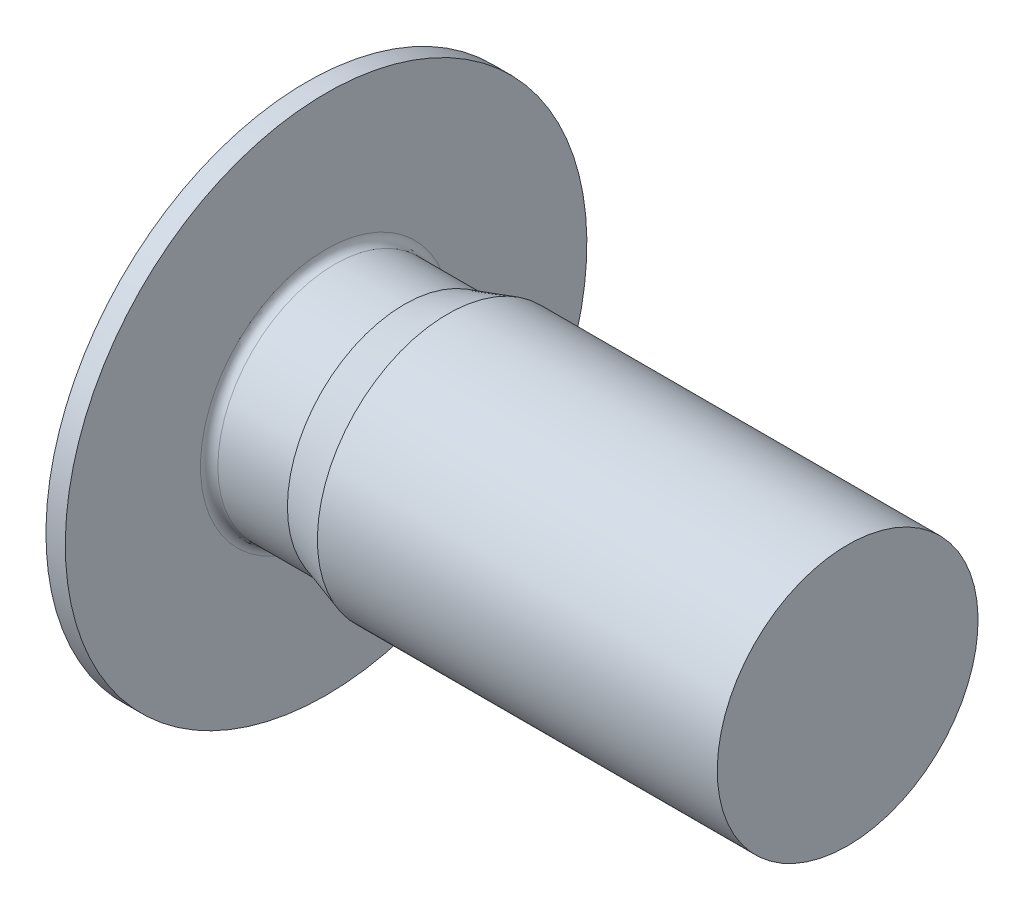
ISO-10303-21;
HEADER;
FILE_DESCRIPTION(('STEP AP214'),'2;1');
FILE_NAME('part.step','',(''),(''),'','','');
FILE_SCHEMA(('AUTOMOTIVE_DESIGN { 1 0 10303 214 1 1 1 1 }'));
ENDSEC;
DATA;
#1=APPLICATION_CONTEXT('core data for automotive mechanical design processes');
#2=APPLICATION_PROTOCOL_DEFINITION('international standard','automotive_design',2000,#1);
#3=PRODUCT_CONTEXT('',#1,'mechanical');
#4=PRODUCT('Part','Part','',(#3));
#5=PRODUCT_RELATED_PRODUCT_CATEGORY('part','',(#4));
#6=PRODUCT_DEFINITION_FORMATION('','',#4);
#7=PRODUCT_DEFINITION_CONTEXT('part definition',#1,'design');
#8=PRODUCT_DEFINITION('design','',#6,#7);
#9=PRODUCT_DEFINITION_SHAPE('','',#8);
#10=(LENGTH_UNIT() NAMED_UNIT(*) SI_UNIT(.MILLI.,.METRE.));
#11=(NAMED_UNIT(*) PLANE_ANGLE_UNIT() SI_UNIT($,.RADIAN.));
#12=(NAMED_UNIT(*) SI_UNIT($,.STERADIAN.) SOLID_ANGLE_UNIT());
#13=UNCERTAINTY_MEASURE_WITH_UNIT(LENGTH_MEASURE(1.E-05),#10,'distance_accuracy_value','');
#14=(GEOMETRIC_REPRESENTATION_CONTEXT(3) GLOBAL_UNCERTAINTY_ASSIGNED_CONTEXT((#13)) GLOBAL_UNIT_ASSIGNED_CONTEXT((#10,
#11,#12)) REPRESENTATION_CONTEXT('',''));
#15=CARTESIAN_POINT('',(0.,0.,0.));
#16=DIRECTION('',(0.,0.,1.));
#17=DIRECTION('',(1.,0.,0.));
#18=AXIS2_PLACEMENT_3D('',#15,#16,#17);
#19=CARTESIAN_POINT('',(1.2,0.,0.));
#20=DIRECTION('',(-1.,0.,0.));
#21=DIRECTION('',(0.,0.,1.));
#22=AXIS2_PLACEMENT_3D('',#19,#20,#21);
#23=PLANE('',#22);
#24=CARTESIAN_POINT('',(1.2,0.,0.));
#25=DIRECTION('',(-1.,0.,0.));
#26=DIRECTION('',(0.,-1.,0.));
#27=AXIS2_PLACEMENT_3D('',#24,#25,#26);
#28=CIRCLE('',#27,0.75);
#29=CARTESIAN_POINT('',(1.2,-0.649519052838329,0.375));
#30=VERTEX_POINT('',#29);
#31=CARTESIAN_POINT('',(1.2,0.,0.75));
#32=VERTEX_POINT('',#31);
#33=EDGE_CURVE('E58',#30,#32,#28,.T.);
#34=ORIENTED_EDGE('',*,*,#33,.F.);
#35=DIRECTION('',(0.,0.5,0.866025403784439));
#36=VECTOR('',#35,1.);
#37=CARTESIAN_POINT('',(1.2,-0.866025403784439,0.));
#38=LINE('',#37,#36);
#39=CARTESIAN_POINT('',(1.2,-0.43301270189222,0.75));
#40=VERTEX_POINT('',#39);
#41=EDGE_CURVE('E309',#30,#40,#38,.T.);
#42=ORIENTED_EDGE('',*,*,#41,.T.);
#43=DIRECTION('',(0.,1.,0.));
#44=VECTOR('',#43,1.);
#45=CARTESIAN_POINT('',(1.2,-0.43301270189222,0.75));
#46=LINE('',#45,#44);
#47=EDGE_CURVE('E261',#40,#32,#46,.T.);
#48=ORIENTED_EDGE('',*,*,#47,.T.);
#49=EDGE_LOOP('',(#34,#42,#48));
#50=FACE_BOUND('',#49,.T.);
#51=ADVANCED_FACE('F46',(#50),#23,.T.);
#52=CARTESIAN_POINT('',(1.2,0.649519052838329,0.375));
#53=VERTEX_POINT('',#52);
#54=EDGE_CURVE('E11',#32,#53,#28,.T.);
#55=ORIENTED_EDGE('',*,*,#54,.F.);
#56=CARTESIAN_POINT('',(1.2,0.43301270189222,0.75));
#57=VERTEX_POINT('',#56);
#58=EDGE_CURVE('E298',#32,#57,#46,.T.);
#59=ORIENTED_EDGE('',*,*,#58,.T.);
#60=DIRECTION('',(0.,0.5,-0.866025403784439));
#61=VECTOR('',#60,1.);
#62=CARTESIAN_POINT('',(1.2,0.43301270189222,0.75));
#63=LINE('',#62,#61);
#64=EDGE_CURVE('E328',#57,#53,#63,.T.);
#65=ORIENTED_EDGE('',*,*,#64,.T.);
#66=EDGE_LOOP('',(#55,#59,#65));
#67=FACE_BOUND('',#66,.T.);
#68=ADVANCED_FACE('F134',(#67),#23,.T.);
#69=CARTESIAN_POINT('',(1.2,0.649519052838329,-0.375));
#70=VERTEX_POINT('',#69);
#71=EDGE_CURVE('E56',#53,#70,#28,.T.);
#72=ORIENTED_EDGE('',*,*,#71,.F.);
#73=CARTESIAN_POINT('',(1.2,0.866025403784439,0.));
#74=VERTEX_POINT('',#73);
#75=EDGE_CURVE('E278',#53,#74,#63,.T.);
#76=ORIENTED_EDGE('',*,*,#75,.T.);
#77=DIRECTION('',(0.,-0.5,-0.866025403784439));
#78=VECTOR('',#77,1.);
#79=CARTESIAN_POINT('',(1.2,0.866025403784439,0.));
#80=LINE('',#79,#78);
#81=EDGE_CURVE('E324',#74,#70,#80,.T.);
#82=ORIENTED_EDGE('',*,*,#81,.T.);
#83=EDGE_LOOP('',(#72,#76,#82));
#84=FACE_BOUND('',#83,.T.);
#85=ADVANCED_FACE('F139',(#84),#23,.T.);
#86=CARTESIAN_POINT('',(1.2,0.,-0.75));
#87=VERTEX_POINT('',#86);
#88=EDGE_CURVE('E247',#70,#87,#28,.T.);
#89=ORIENTED_EDGE('',*,*,#88,.F.);
#90=CARTESIAN_POINT('',(1.2,0.433012701892219,-0.75));
#91=VERTEX_POINT('',#90);
#92=EDGE_CURVE('E327',#70,#91,#80,.T.);
#93=ORIENTED_EDGE('',*,*,#92,.T.);
#94=DIRECTION('',(0.,-1.,0.));
#95=VECTOR('',#94,1.);
#96=CARTESIAN_POINT('',(1.2,0.433012701892219,-0.75));
#97=LINE('',#96,#95);
#98=EDGE_CURVE('E319',#91,#87,#97,.T.);
#99=ORIENTED_EDGE('',*,*,#98,.T.);
#100=EDGE_LOOP('',(#89,#93,#99));
#101=FACE_BOUND('',#100,.T.);
#102=ADVANCED_FACE('F198',(#101),#23,.T.);
#103=CARTESIAN_POINT('',(1.2,-0.649519052838329,-0.375));
#104=VERTEX_POINT('',#103);
#105=EDGE_CURVE('E65',#87,#104,#28,.T.);
#106=ORIENTED_EDGE('',*,*,#105,.F.);
#107=CARTESIAN_POINT('',(1.2,-0.43301270189222,-0.75));
#108=VERTEX_POINT('',#107);
#109=EDGE_CURVE('E323',#87,#108,#97,.T.);
#110=ORIENTED_EDGE('',*,*,#109,.T.);
#111=DIRECTION('',(0.,-0.5,0.866025403784438));
#112=VECTOR('',#111,1.);
#113=CARTESIAN_POINT('',(1.2,-0.43301270189222,-0.75));
#114=LINE('',#113,#112);
#115=EDGE_CURVE('E313',#108,#104,#114,.T.);
#116=ORIENTED_EDGE('',*,*,#115,.T.);
#117=EDGE_LOOP('',(#106,#110,#116));
#118=FACE_BOUND('',#117,.T.);
#119=ADVANCED_FACE('F132',(#118),#23,.T.);
#120=CARTESIAN_POINT('',(-0.8,0.,0.));
#121=DIRECTION('',(-1.,0.,0.));
#122=DIRECTION('',(0.,-1.,0.));
#123=AXIS2_PLACEMENT_3D('',#120,#121,#122);
#124=CYLINDRICAL_SURFACE('',#123,1.345);
#125=CARTESIAN_POINT('',(0.1,0.,0.));
#126=DIRECTION('',(-1.,0.,0.));
#127=DIRECTION('',(0.,-1.,0.));
#128=AXIS2_PLACEMENT_3D('',#125,#126,#127);
#129=CIRCLE('',#128,1.345);
#130=CARTESIAN_POINT('',(0.1,-1.345,0.));
#131=VERTEX_POINT('',#130);
#132=EDGE_CURVE('E50',#131,#131,#129,.F.);
#133=ORIENTED_EDGE('',*,*,#132,.T.);
#134=EDGE_LOOP('',(#133));
#135=FACE_BOUND('',#134,.T.);
#136=CARTESIAN_POINT('',(0.9,0.,0.));
#137=DIRECTION('',(-1.,0.,0.));
#138=DIRECTION('',(0.,-1.,0.));
#139=AXIS2_PLACEMENT_3D('',#136,#137,#138);
#140=CIRCLE('',#139,1.345);
#141=CARTESIAN_POINT('',(0.9,-1.345,0.));
#142=VERTEX_POINT('',#141);
#143=EDGE_CURVE('E205',#142,#142,#140,.T.);
#144=ORIENTED_EDGE('',*,*,#143,.T.);
#145=EDGE_LOOP('',(#144));
#146=FACE_BOUND('',#145,.T.);
#147=ADVANCED_FACE('F191',(#135,#146),#124,.T.);
#148=CARTESIAN_POINT('',(0.,3.,0.));
#149=DIRECTION('',(-1.,0.,0.));
#150=DIRECTION('',(0.,-1.,0.));
#151=AXIS2_PLACEMENT_3D('',#148,#149,#150);
#152=PLANE('',#151);
#153=CARTESIAN_POINT('',(0.,0.,0.));
#154=DIRECTION('',(-1.,0.,0.));
#155=DIRECTION('',(0.,-1.,0.));
#156=AXIS2_PLACEMENT_3D('',#153,#154,#155);
#157=CIRCLE('',#156,1.445);
#158=CARTESIAN_POINT('',(0.,-1.445,0.));
#159=VERTEX_POINT('',#158);
#160=EDGE_CURVE('E236',#159,#159,#157,.T.);
#161=ORIENTED_EDGE('',*,*,#160,.T.);
#162=EDGE_LOOP('',(#161));
#163=FACE_BOUND('',#162,.T.);
#164=CARTESIAN_POINT('',(0.,0.,0.));
#165=DIRECTION('',(-1.,0.,0.));
#166=DIRECTION('',(0.,-1.,0.));
#167=AXIS2_PLACEMENT_3D('',#164,#165,#166);
#168=CIRCLE('',#167,3.);
#169=CARTESIAN_POINT('',(0.,-3.,0.));
#170=VERTEX_POINT('',#169);
#171=EDGE_CURVE('E233',#170,#170,#168,.T.);
#172=ORIENTED_EDGE('',*,*,#171,.F.);
#173=EDGE_LOOP('',(#172));
#174=FACE_BOUND('',#173,.T.);
#175=ADVANCED_FACE('F188',(#163,#174),#152,.F.);
#176=CARTESIAN_POINT('',(-0.8,0.,0.));
#177=DIRECTION('',(-1.,0.,0.));
#178=DIRECTION('',(0.,-1.,0.));
#179=AXIS2_PLACEMENT_3D('',#176,#177,#178);
#180=CYLINDRICAL_SURFACE('',#179,3.);
#181=CARTESIAN_POINT('',(-0.222649730810382,0.,0.));
#182=DIRECTION('',(-1.,0.,0.));
#183=DIRECTION('',(0.,-1.,0.));
#184=AXIS2_PLACEMENT_3D('',#181,#182,#183);
#185=CIRCLE('',#184,3.);
#186=CARTESIAN_POINT('',(-0.222649730810382,-3.,0.));
#187=VERTEX_POINT('',#186);
#188=EDGE_CURVE('E229',#187,#187,#185,.T.);
#189=ORIENTED_EDGE('',*,*,#188,.F.);
#190=EDGE_LOOP('',(#189));
#191=FACE_BOUND('',#190,.T.);
#192=ORIENTED_EDGE('',*,*,#171,.T.);
#193=EDGE_LOOP('',(#192));
#194=FACE_BOUND('',#193,.T.);
#195=ADVANCED_FACE('F184',(#191,#194),#180,.T.);
#196=CARTESIAN_POINT('',(-0.222649730810382,0.,0.));
#197=DIRECTION('',(1.,0.,0.));
#198=DIRECTION('',(0.,1.,0.));
#199=AXIS2_PLACEMENT_3D('',#196,#197,#198);
#200=CONICAL_SURFACE('',#199,3.,1.0471975511966);
#201=CARTESIAN_POINT('',(-0.8,0.,0.));
#202=DIRECTION('',(-1.,0.,0.));
#203=DIRECTION('',(0.,-1.,0.));
#204=AXIS2_PLACEMENT_3D('',#201,#202,#203);
#205=CIRCLE('',#204,2.);
#206=CARTESIAN_POINT('',(-0.799999999999999,-2.,0.));
#207=VERTEX_POINT('',#206);
#208=EDGE_CURVE('E225',#207,#207,#205,.T.);
#209=ORIENTED_EDGE('',*,*,#208,.F.);
#210=EDGE_LOOP('',(#209));
#211=FACE_BOUND('',#210,.T.);
#212=ORIENTED_EDGE('',*,*,#188,.T.);
#213=EDGE_LOOP('',(#212));
#214=FACE_BOUND('',#213,.T.);
#215=ADVANCED_FACE('F180',(#211,#214),#200,.T.);
#216=CARTESIAN_POINT('',(-0.8,0.,0.));
#217=DIRECTION('',(1.,0.,0.));
#218=DIRECTION('',(0.,1.,0.));
#219=AXIS2_PLACEMENT_3D('',#216,#217,#218);
#220=PLANE('',#219);
#221=DIRECTION('',(0.,-0.5,-0.866025403784439));
#222=VECTOR('',#221,1.);
#223=CARTESIAN_POINT('',(-0.8,0.866025403784439,0.));
#224=LINE('',#223,#222);
#225=CARTESIAN_POINT('',(-0.8,0.866025403784439,0.));
#226=VERTEX_POINT('',#225);
#227=CARTESIAN_POINT('',(-0.8,0.433012701892219,-0.75));
#228=VERTEX_POINT('',#227);
#229=EDGE_CURVE('E253',#226,#228,#224,.T.);
#230=ORIENTED_EDGE('',*,*,#229,.F.);
#231=DIRECTION('',(0.,0.5,-0.866025403784439));
#232=VECTOR('',#231,1.);
#233=CARTESIAN_POINT('',(-0.8,0.43301270189222,0.75));
#234=LINE('',#233,#232);
#235=CARTESIAN_POINT('',(-0.8,0.43301270189222,0.75));
#236=VERTEX_POINT('',#235);
#237=EDGE_CURVE('E73',#236,#226,#234,.T.);
#238=ORIENTED_EDGE('',*,*,#237,.F.);
#239=DIRECTION('',(0.,1.,0.));
#240=VECTOR('',#239,1.);
#241=CARTESIAN_POINT('',(-0.8,-0.43301270189222,0.75));
#242=LINE('',#241,#240);
#243=CARTESIAN_POINT('',(-0.8,-0.43301270189222,0.75));
#244=VERTEX_POINT('',#243);
#245=EDGE_CURVE('E275',#244,#236,#242,.T.);
#246=ORIENTED_EDGE('',*,*,#245,.F.);
#247=DIRECTION('',(0.,0.5,0.866025403784439));
#248=VECTOR('',#247,1.);
#249=CARTESIAN_POINT('',(-0.8,-0.866025403784439,0.));
#250=LINE('',#249,#248);
#251=CARTESIAN_POINT('',(-0.8,-0.866025403784439,0.));
#252=VERTEX_POINT('',#251);
#253=EDGE_CURVE('E271',#252,#244,#250,.T.);
#254=ORIENTED_EDGE('',*,*,#253,.F.);
#255=DIRECTION('',(0.,-0.5,0.866025403784438));
#256=VECTOR('',#255,1.);
#257=CARTESIAN_POINT('',(-0.8,-0.43301270189222,-0.75));
#258=LINE('',#257,#256);
#259=CARTESIAN_POINT('',(-0.8,-0.43301270189222,-0.75));
#260=VERTEX_POINT('',#259);
#261=EDGE_CURVE('E267',#260,#252,#258,.T.);
#262=ORIENTED_EDGE('',*,*,#261,.F.);
#263=DIRECTION('',(0.,-1.,0.));
#264=VECTOR('',#263,1.);
#265=CARTESIAN_POINT('',(-0.8,0.433012701892219,-0.75));
#266=LINE('',#265,#264);
#267=EDGE_CURVE('E258',#228,#260,#266,.T.);
#268=ORIENTED_EDGE('',*,*,#267,.F.);
#269=EDGE_LOOP('',(#230,#238,#246,#254,#262,#268));
#270=FACE_BOUND('',#269,.T.);
#271=ORIENTED_EDGE('',*,*,#208,.T.);
#272=EDGE_LOOP('',(#271));
#273=FACE_BOUND('',#272,.T.);
#274=ADVANCED_FACE('F176',(#270,#273),#220,.F.);
#275=CARTESIAN_POINT('',(6.,1.5,0.));
#276=DIRECTION('',(-1.,0.,0.));
#277=DIRECTION('',(0.,-1.,0.));
#278=AXIS2_PLACEMENT_3D('',#275,#276,#277);
#279=PLANE('',#278);
#280=CARTESIAN_POINT('',(6.,0.,0.));
#281=DIRECTION('',(-1.,0.,0.));
#282=DIRECTION('',(0.,-1.,0.));
#283=AXIS2_PLACEMENT_3D('',#280,#281,#282);
#284=CIRCLE('',#283,1.5);
#285=CARTESIAN_POINT('',(6.,-1.5,0.));
#286=VERTEX_POINT('',#285);
#287=EDGE_CURVE('E214',#286,#286,#284,.T.);
#288=ORIENTED_EDGE('',*,*,#287,.F.);
#289=EDGE_LOOP('',(#288));
#290=FACE_BOUND('',#289,.T.);
#291=ADVANCED_FACE('F172',(#290),#279,.F.);
#292=CARTESIAN_POINT('',(-0.8,0.,0.));
#293=DIRECTION('',(-1.,0.,0.));
#294=DIRECTION('',(0.,-1.,0.));
#295=AXIS2_PLACEMENT_3D('',#292,#293,#294);
#296=CYLINDRICAL_SURFACE('',#295,1.5);
#297=CARTESIAN_POINT('',(1.4,0.,0.));
#298=DIRECTION('',(-1.,0.,0.));
#299=DIRECTION('',(0.,-1.,0.));
#300=AXIS2_PLACEMENT_3D('',#297,#298,#299);
#301=CIRCLE('',#300,1.5);
#302=CARTESIAN_POINT('',(1.4,-1.5,0.));
#303=VERTEX_POINT('',#302);
#304=EDGE_CURVE('E207',#303,#303,#301,.T.);
#305=ORIENTED_EDGE('',*,*,#304,.F.);
#306=EDGE_LOOP('',(#305));
#307=FACE_BOUND('',#306,.T.);
#308=ORIENTED_EDGE('',*,*,#287,.T.);
#309=EDGE_LOOP('',(#308));
#310=FACE_BOUND('',#309,.T.);
#311=ADVANCED_FACE('F168',(#307,#310),#296,.T.);
#312=CARTESIAN_POINT('',(1.4,0.,0.));
#313=DIRECTION('',(1.,0.,0.));
#314=DIRECTION('',(0.,1.,0.));
#315=AXIS2_PLACEMENT_3D('',#312,#313,#314);
#316=CONICAL_SURFACE('',#315,1.5,0.300605670042395);
#317=ORIENTED_EDGE('',*,*,#143,.F.);
#318=EDGE_LOOP('',(#317));
#319=FACE_BOUND('',#318,.T.);
#320=ORIENTED_EDGE('',*,*,#304,.T.);
#321=EDGE_LOOP('',(#320));
#322=FACE_BOUND('',#321,.T.);
#323=ADVANCED_FACE('F165',(#319,#322),#316,.T.);
#324=CARTESIAN_POINT('',(0.1,0.,0.));
#325=DIRECTION('',(-1.,0.,0.));
#326=DIRECTION('',(0.,-1.,0.));
#327=AXIS2_PLACEMENT_3D('',#324,#325,#326);
#328=TOROIDAL_SURFACE('',#327,1.445,0.1);
#329=ORIENTED_EDGE('',*,*,#132,.F.);
#330=EDGE_LOOP('',(#329));
#331=FACE_BOUND('',#330,.T.);
#332=ORIENTED_EDGE('',*,*,#160,.F.);
#333=EDGE_LOOP('',(#332));
#334=FACE_BOUND('',#333,.T.);
#335=ADVANCED_FACE('F48',(#331,#334),#328,.F.);
#336=CARTESIAN_POINT('',(1.2,0.43301270189222,0.75));
#337=DIRECTION('',(0.,0.866025403784439,0.5));
#338=DIRECTION('',(0.,-0.5,0.866025403784439));
#339=AXIS2_PLACEMENT_3D('',#336,#337,#338);
#340=PLANE('',#339);
#341=ORIENTED_EDGE('',*,*,#237,.T.);
#342=DIRECTION('',(-1.,0.,0.));
#343=VECTOR('',#342,1.);
#344=CARTESIAN_POINT('',(1.2,0.866025403784439,0.));
#345=LINE('',#344,#343);
#346=EDGE_CURVE('E219',#74,#226,#345,.T.);
#347=ORIENTED_EDGE('',*,*,#346,.F.);
#348=ORIENTED_EDGE('',*,*,#75,.F.);
#349=ORIENTED_EDGE('',*,*,#64,.F.);
#350=DIRECTION('',(-1.,0.,0.));
#351=VECTOR('',#350,1.);
#352=CARTESIAN_POINT('',(1.2,0.43301270189222,0.75));
#353=LINE('',#352,#351);
#354=EDGE_CURVE('E208',#57,#236,#353,.T.);
#355=ORIENTED_EDGE('',*,*,#354,.T.);
#356=EDGE_LOOP('',(#341,#347,#348,#349,#355));
#357=FACE_BOUND('',#356,.T.);
#358=ADVANCED_FACE('F147',(#357),#340,.F.);
#359=CARTESIAN_POINT('',(1.2,-0.43301270189222,0.75));
#360=DIRECTION('',(0.,0.,1.));
#361=DIRECTION('',(0.,-1.,0.));
#362=AXIS2_PLACEMENT_3D('',#359,#360,#361);
#363=PLANE('',#362);
#364=ORIENTED_EDGE('',*,*,#245,.T.);
#365=ORIENTED_EDGE('',*,*,#354,.F.);
#366=ORIENTED_EDGE('',*,*,#58,.F.);
#367=ORIENTED_EDGE('',*,*,#47,.F.);
#368=DIRECTION('',(-1.,0.,0.));
#369=VECTOR('',#368,1.);
#370=CARTESIAN_POINT('',(1.2,-0.43301270189222,0.75));
#371=LINE('',#370,#369);
#372=EDGE_CURVE('E216',#40,#244,#371,.T.);
#373=ORIENTED_EDGE('',*,*,#372,.T.);
#374=EDGE_LOOP('',(#364,#365,#366,#367,#373));
#375=FACE_BOUND('',#374,.T.);
#376=ADVANCED_FACE('F143',(#375),#363,.F.);
#377=CARTESIAN_POINT('',(1.2,-0.866025403784439,0.));
#378=DIRECTION('',(0.,-0.866025403784439,0.5));
#379=DIRECTION('',(0.,-0.5,-0.866025403784439));
#380=AXIS2_PLACEMENT_3D('',#377,#378,#379);
#381=PLANE('',#380);
#382=ORIENTED_EDGE('',*,*,#253,.T.);
#383=ORIENTED_EDGE('',*,*,#372,.F.);
#384=ORIENTED_EDGE('',*,*,#41,.F.);
#385=CARTESIAN_POINT('',(1.2,-0.866025403784439,0.));
#386=VERTEX_POINT('',#385);
#387=EDGE_CURVE('E302',#386,#30,#38,.T.);
#388=ORIENTED_EDGE('',*,*,#387,.F.);
#389=DIRECTION('',(-1.,0.,0.));
#390=VECTOR('',#389,1.);
#391=CARTESIAN_POINT('',(1.2,-0.866025403784439,0.));
#392=LINE('',#391,#390);
#393=EDGE_CURVE('E282',#386,#252,#392,.T.);
#394=ORIENTED_EDGE('',*,*,#393,.T.);
#395=EDGE_LOOP('',(#382,#383,#384,#388,#394));
#396=FACE_BOUND('',#395,.T.);
#397=ADVANCED_FACE('F146',(#396),#381,.F.);
#398=CARTESIAN_POINT('',(1.2,-0.43301270189222,-0.75));
#399=DIRECTION('',(0.,-0.866025403784438,-0.5));
#400=DIRECTION('',(0.,0.5,-0.866025403784439));
#401=AXIS2_PLACEMENT_3D('',#398,#399,#400);
#402=PLANE('',#401);
#403=ORIENTED_EDGE('',*,*,#261,.T.);
#404=ORIENTED_EDGE('',*,*,#393,.F.);
#405=EDGE_CURVE('E318',#104,#386,#114,.T.);
#406=ORIENTED_EDGE('',*,*,#405,.F.);
#407=ORIENTED_EDGE('',*,*,#115,.F.);
#408=DIRECTION('',(-1.,0.,0.));
#409=VECTOR('',#408,1.);
#410=CARTESIAN_POINT('',(1.2,-0.43301270189222,-0.75));
#411=LINE('',#410,#409);
#412=EDGE_CURVE('E285',#108,#260,#411,.T.);
#413=ORIENTED_EDGE('',*,*,#412,.T.);
#414=EDGE_LOOP('',(#403,#404,#406,#407,#413));
#415=FACE_BOUND('',#414,.T.);
#416=ADVANCED_FACE('F151',(#415),#402,.F.);
#417=CARTESIAN_POINT('',(1.2,0.433012701892219,-0.75));
#418=DIRECTION('',(0.,0.,-1.));
#419=DIRECTION('',(-1.,0.,0.));
#420=AXIS2_PLACEMENT_3D('',#417,#418,#419);
#421=PLANE('',#420);
#422=ORIENTED_EDGE('',*,*,#267,.T.);
#423=ORIENTED_EDGE('',*,*,#412,.F.);
#424=ORIENTED_EDGE('',*,*,#109,.F.);
#425=ORIENTED_EDGE('',*,*,#98,.F.);
#426=DIRECTION('',(-1.,0.,0.));
#427=VECTOR('',#426,1.);
#428=CARTESIAN_POINT('',(1.2,0.433012701892219,-0.75));
#429=LINE('',#428,#427);
#430=EDGE_CURVE('E287',#91,#228,#429,.T.);
#431=ORIENTED_EDGE('',*,*,#430,.T.);
#432=EDGE_LOOP('',(#422,#423,#424,#425,#431));
#433=FACE_BOUND('',#432,.T.);
#434=ADVANCED_FACE('F155',(#433),#421,.F.);
#435=CARTESIAN_POINT('',(1.2,0.866025403784439,0.));
#436=DIRECTION('',(0.,0.866025403784439,-0.5));
#437=DIRECTION('',(0.,0.5,0.866025403784439));
#438=AXIS2_PLACEMENT_3D('',#435,#436,#437);
#439=PLANE('',#438);
#440=ORIENTED_EDGE('',*,*,#229,.T.);
#441=ORIENTED_EDGE('',*,*,#430,.F.);
#442=ORIENTED_EDGE('',*,*,#92,.F.);
#443=ORIENTED_EDGE('',*,*,#81,.F.);
#444=ORIENTED_EDGE('',*,*,#346,.T.);
#445=EDGE_LOOP('',(#440,#441,#442,#443,#444));
#446=FACE_BOUND('',#445,.T.);
#447=ADVANCED_FACE('F129',(#446),#439,.F.);
#448=EDGE_CURVE('E242',#104,#30,#28,.T.);
#449=ORIENTED_EDGE('',*,*,#448,.F.);
#450=ORIENTED_EDGE('',*,*,#405,.T.);
#451=ORIENTED_EDGE('',*,*,#387,.T.);
#452=EDGE_LOOP('',(#449,#450,#451));
#453=FACE_BOUND('',#452,.T.);
#454=ADVANCED_FACE('F124',(#453),#23,.T.);
#455=CARTESIAN_POINT('',(1.65064546427067,0.,0.));
#456=DIRECTION('',(-1.,0.,0.));
#457=DIRECTION('',(0.,-1.,0.));
#458=AXIS2_PLACEMENT_3D('',#455,#456,#457);
#459=CONICAL_SURFACE('',#458,0.,1.02974425867666);
#460=ORIENTED_EDGE('',*,*,#33,.T.);
#461=ORIENTED_EDGE('',*,*,#54,.T.);
#462=ORIENTED_EDGE('',*,*,#71,.T.);
#463=ORIENTED_EDGE('',*,*,#88,.T.);
#464=ORIENTED_EDGE('',*,*,#105,.T.);
#465=ORIENTED_EDGE('',*,*,#448,.T.);
#466=EDGE_LOOP('',(#460,#461,#462,#463,#464,#465));
#467=FACE_BOUND('',#466,.T.);
#468=CARTESIAN_POINT('',(1.65064546427067,0.,0.));
#469=VERTEX_POINT('',#468);
#470=VERTEX_LOOP('',#469);
#471=FACE_BOUND('',#470,.T.);
#472=ADVANCED_FACE('F122',(#467,#471),#459,.F.);
#473=CLOSED_SHELL('',(#51,#68,#85,#102,#119,#147,#175,#195,#215,#274,#291,#311,#323,#335,#358,
#376,#397,#416,#434,#447,#454,#472));
#474=MANIFOLD_SOLID_BREP('B2',#473);
#475=ADVANCED_BREP_SHAPE_REPRESENTATION('',(#18,#474),#14);
#476=SHAPE_DEFINITION_REPRESENTATION(#9,#475);
ENDSEC;
END-ISO-10303-21;
